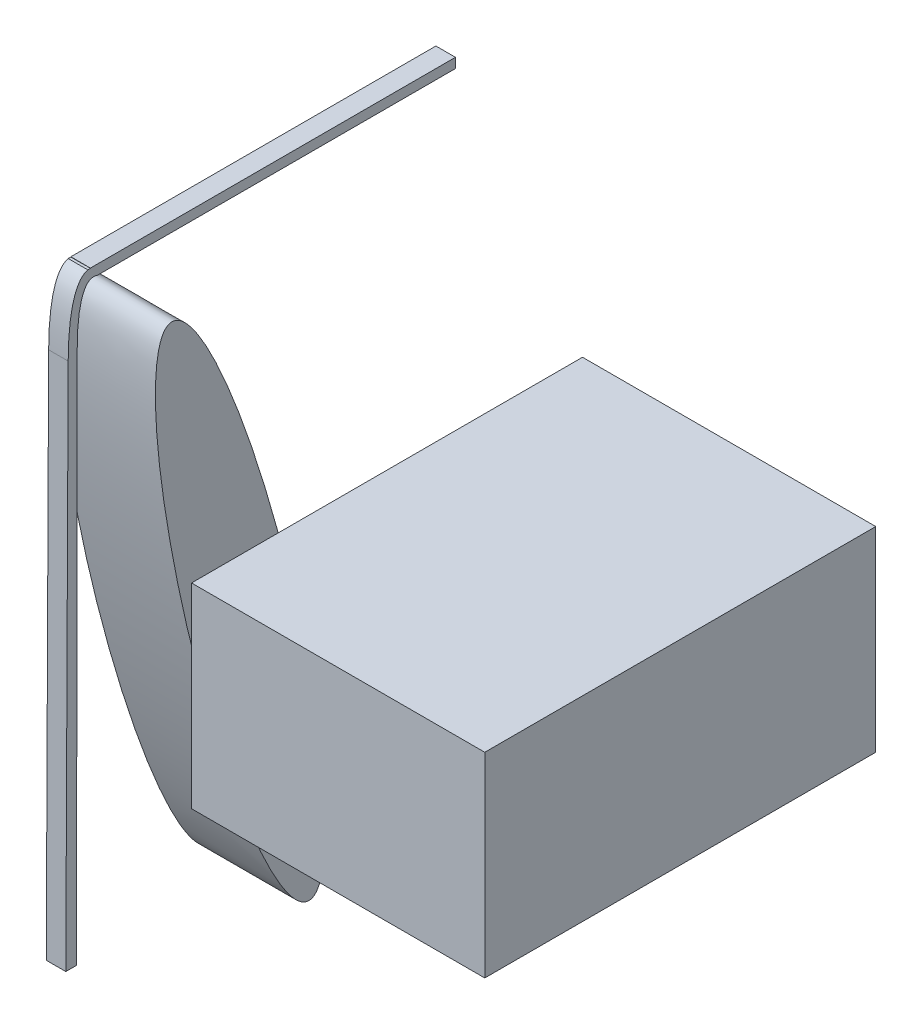
ISO-10303-21;
HEADER;
FILE_DESCRIPTION(('STEP AP214'),'2;1');
FILE_NAME('part.step','',(''),(''),'','','');
FILE_SCHEMA(('AUTOMOTIVE_DESIGN { 1 0 10303 214 1 1 1 1 }'));
ENDSEC;
DATA;
#1=APPLICATION_CONTEXT('core data for automotive mechanical design processes');
#2=APPLICATION_PROTOCOL_DEFINITION('international standard','automotive_design',2000,#1);
#3=PRODUCT_CONTEXT('',#1,'mechanical');
#4=PRODUCT('Part','Part','',(#3));
#5=PRODUCT_RELATED_PRODUCT_CATEGORY('part','',(#4));
#6=PRODUCT_DEFINITION_FORMATION('','',#4);
#7=PRODUCT_DEFINITION_CONTEXT('part definition',#1,'design');
#8=PRODUCT_DEFINITION('design','',#6,#7);
#9=PRODUCT_DEFINITION_SHAPE('','',#8);
#10=(LENGTH_UNIT() NAMED_UNIT(*) SI_UNIT(.MILLI.,.METRE.));
#11=(NAMED_UNIT(*) PLANE_ANGLE_UNIT() SI_UNIT($,.RADIAN.));
#12=(NAMED_UNIT(*) SI_UNIT($,.STERADIAN.) SOLID_ANGLE_UNIT());
#13=UNCERTAINTY_MEASURE_WITH_UNIT(LENGTH_MEASURE(1.E-05),#10,'distance_accuracy_value','');
#14=(GEOMETRIC_REPRESENTATION_CONTEXT(3) GLOBAL_UNCERTAINTY_ASSIGNED_CONTEXT((#13)) GLOBAL_UNIT_ASSIGNED_CONTEXT((#10,
#11,#12)) REPRESENTATION_CONTEXT('',''));
#15=CARTESIAN_POINT('',(0.,0.,0.));
#16=DIRECTION('',(0.,0.,1.));
#17=DIRECTION('',(1.,0.,0.));
#18=AXIS2_PLACEMENT_3D('',#15,#16,#17);
#19=CARTESIAN_POINT('',(-13.,0.,37.3485003244142));
#20=DIRECTION('',(0.,0.,1.));
#21=DIRECTION('',(1.,0.,0.));
#22=AXIS2_PLACEMENT_3D('',#19,#20,#21);
#23=PLANE('',#22);
#24=DIRECTION('',(0.,1.,0.));
#25=VECTOR('',#24,1.);
#26=CARTESIAN_POINT('',(-15.,0.,37.3485003244142));
#27=LINE('',#26,#25);
#28=CARTESIAN_POINT('',(-15.,40.0508557961112,37.3485003244142));
#29=VERTEX_POINT('',#28);
#30=CARTESIAN_POINT('',(-15.,40.0746483582424,37.3485003244142));
#31=VERTEX_POINT('',#30);
#32=EDGE_CURVE('E500',#29,#31,#27,.T.);
#33=ORIENTED_EDGE('',*,*,#32,.F.);
#34=DIRECTION('',(1.,0.,0.));
#35=VECTOR('',#34,1.);
#36=CARTESIAN_POINT('',(-13.,40.0508557961112,37.3485003244142));
#37=LINE('',#36,#35);
#38=CARTESIAN_POINT('',(-13.,40.0508557961112,37.3485003244142));
#39=VERTEX_POINT('',#38);
#40=EDGE_CURVE('E493',#29,#39,#37,.T.);
#41=ORIENTED_EDGE('',*,*,#40,.T.);
#42=DIRECTION('',(0.,1.,0.));
#43=VECTOR('',#42,1.);
#44=CARTESIAN_POINT('',(-13.,0.,37.3485003244142));
#45=LINE('',#44,#43);
#46=CARTESIAN_POINT('',(-13.,40.0746483582424,37.3485003244142));
#47=VERTEX_POINT('',#46);
#48=EDGE_CURVE('E524',#39,#47,#45,.T.);
#49=ORIENTED_EDGE('',*,*,#48,.T.);
#50=DIRECTION('',(-1.,0.,0.));
#51=VECTOR('',#50,1.);
#52=CARTESIAN_POINT('',(-13.,40.0746483582424,37.3485003244142));
#53=LINE('',#52,#51);
#54=EDGE_CURVE('E502',#47,#31,#53,.T.);
#55=ORIENTED_EDGE('',*,*,#54,.T.);
#56=EDGE_LOOP('',(#33,#41,#49,#55));
#57=FACE_BOUND('',#56,.T.);
#58=ADVANCED_FACE('F37',(#57),#23,.T.);
#59=CARTESIAN_POINT('',(-15.,10.,30.));
#60=DIRECTION('',(-1.,0.,0.));
#61=DIRECTION('',(0.,0.970628381176253,0.240583760165074));
#62=AXIS2_PLACEMENT_3D('',#59,#60,#61);
#63=ELLIPSE('',#62,30.,5.);
#64=DIRECTION('',(1.,0.,0.));
#65=VECTOR('',#64,1.);
#66=SURFACE_OF_LINEAR_EXTRUSION('',#63,#65);
#67=CARTESIAN_POINT('',(-5.,10.,30.));
#68=DIRECTION('',(-1.,0.,0.));
#69=DIRECTION('',(0.,0.970628381176253,0.240583760165074));
#70=AXIS2_PLACEMENT_3D('',#67,#68,#69);
#71=ELLIPSE('',#70,30.,5.);
#72=CARTESIAN_POINT('',(-5.,39.1188514352876,37.2175128049522));
#73=VERTEX_POINT('',#72);
#74=EDGE_CURVE('E223',#73,#73,#71,.T.);
#75=ORIENTED_EDGE('',*,*,#74,.T.);
#76=EDGE_LOOP('',(#75));
#77=FACE_BOUND('',#76,.T.);
#78=DIRECTION('',(1.,0.,0.));
#79=VECTOR('',#78,1.);
#80=CARTESIAN_POINT('',(-15.,39.0746483582424,36.6403753439607));
#81=LINE('',#80,#79);
#82=CARTESIAN_POINT('',(-13.,39.0746483582424,36.6403753439607));
#83=VERTEX_POINT('',#82);
#84=CARTESIAN_POINT('',(-15.,39.0746483582424,36.6403753439607));
#85=VERTEX_POINT('',#84);
#86=EDGE_CURVE('E224',#83,#85,#81,.F.);
#87=ORIENTED_EDGE('',*,*,#86,.F.);
#88=CARTESIAN_POINT('',(-13.,10.,30.));
#89=DIRECTION('',(-1.,0.,0.));
#90=DIRECTION('',(0.,0.970628381176253,0.240583760165074));
#91=AXIS2_PLACEMENT_3D('',#88,#89,#90);
#92=ELLIPSE('',#91,30.,5.);
#93=CARTESIAN_POINT('',(-13.,33.5140158510238,38.697434300692));
#94=VERTEX_POINT('',#93);
#95=EDGE_CURVE('E11',#94,#83,#92,.T.);
#96=ORIENTED_EDGE('',*,*,#95,.F.);
#97=DIRECTION('',(-1.,0.,0.));
#98=VECTOR('',#97,1.);
#99=CARTESIAN_POINT('',(-13.,33.5140158510238,38.697434300692));
#100=LINE('',#99,#98);
#101=CARTESIAN_POINT('',(-15.,33.5140158510238,38.697434300692));
#102=VERTEX_POINT('',#101);
#103=EDGE_CURVE('E161',#94,#102,#100,.T.);
#104=ORIENTED_EDGE('',*,*,#103,.T.);
#105=EDGE_CURVE('E218',#85,#102,#63,.T.);
#106=ORIENTED_EDGE('',*,*,#105,.F.);
#107=EDGE_LOOP('',(#87,#96,#104,#106));
#108=FACE_BOUND('',#107,.T.);
#109=ADVANCED_FACE('F200',(#77,#108),#66,.F.);
#110=CARTESIAN_POINT('',(0.,0.,40.));
#111=DIRECTION('',(1.,0.,0.));
#112=DIRECTION('',(0.,0.,-1.));
#113=AXIS2_PLACEMENT_3D('',#110,#111,#112);
#114=PLANE('',#113);
#115=CARTESIAN_POINT('',(0.,10.,30.));
#116=DIRECTION('',(1.,0.,0.));
#117=DIRECTION('',(0.,0.,-1.));
#118=AXIS2_PLACEMENT_3D('',#115,#116,#117);
#119=CIRCLE('',#118,2.);
#120=CARTESIAN_POINT('',(0.,10.,28.));
#121=VERTEX_POINT('',#120);
#122=EDGE_CURVE('E45',#121,#121,#119,.F.);
#123=ORIENTED_EDGE('',*,*,#122,.F.);
#124=EDGE_LOOP('',(#123));
#125=FACE_BOUND('',#124,.T.);
#126=DIRECTION('',(0.,-1.,0.));
#127=VECTOR('',#126,1.);
#128=CARTESIAN_POINT('',(0.,0.,0.));
#129=LINE('',#128,#127);
#130=CARTESIAN_POINT('',(0.,20.,0.));
#131=VERTEX_POINT('',#130);
#132=CARTESIAN_POINT('',(0.,0.,0.));
#133=VERTEX_POINT('',#132);
#134=EDGE_CURVE('E230',#131,#133,#129,.T.);
#135=ORIENTED_EDGE('',*,*,#134,.T.);
#136=DIRECTION('',(0.,0.,-1.));
#137=VECTOR('',#136,1.);
#138=CARTESIAN_POINT('',(0.,0.,40.));
#139=LINE('',#138,#137);
#140=CARTESIAN_POINT('',(0.,0.,40.));
#141=VERTEX_POINT('',#140);
#142=EDGE_CURVE('E257',#141,#133,#139,.T.);
#143=ORIENTED_EDGE('',*,*,#142,.F.);
#144=DIRECTION('',(0.,-1.,0.));
#145=VECTOR('',#144,1.);
#146=CARTESIAN_POINT('',(0.,0.,40.));
#147=LINE('',#146,#145);
#148=CARTESIAN_POINT('',(0.,20.,40.));
#149=VERTEX_POINT('',#148);
#150=EDGE_CURVE('E231',#149,#141,#147,.T.);
#151=ORIENTED_EDGE('',*,*,#150,.F.);
#152=DIRECTION('',(0.,0.,-1.));
#153=VECTOR('',#152,1.);
#154=CARTESIAN_POINT('',(0.,20.,40.));
#155=LINE('',#154,#153);
#156=EDGE_CURVE('E241',#149,#131,#155,.T.);
#157=ORIENTED_EDGE('',*,*,#156,.T.);
#158=EDGE_LOOP('',(#135,#143,#151,#157));
#159=FACE_BOUND('',#158,.T.);
#160=ADVANCED_FACE('F39',(#125,#159),#114,.F.);
#161=CARTESIAN_POINT('',(0.,0.,40.));
#162=DIRECTION('',(0.,1.,0.));
#163=DIRECTION('',(0.,0.,1.));
#164=AXIS2_PLACEMENT_3D('',#161,#162,#163);
#165=PLANE('',#164);
#166=DIRECTION('',(1.,0.,0.));
#167=VECTOR('',#166,1.);
#168=CARTESIAN_POINT('',(0.,0.,0.));
#169=LINE('',#168,#167);
#170=CARTESIAN_POINT('',(30.,0.,0.));
#171=VERTEX_POINT('',#170);
#172=EDGE_CURVE('E244',#133,#171,#169,.T.);
#173=ORIENTED_EDGE('',*,*,#172,.T.);
#174=DIRECTION('',(0.,0.,-1.));
#175=VECTOR('',#174,1.);
#176=CARTESIAN_POINT('',(30.,0.,40.));
#177=LINE('',#176,#175);
#178=CARTESIAN_POINT('',(30.,0.,40.));
#179=VERTEX_POINT('',#178);
#180=EDGE_CURVE('E254',#179,#171,#177,.T.);
#181=ORIENTED_EDGE('',*,*,#180,.F.);
#182=DIRECTION('',(1.,0.,0.));
#183=VECTOR('',#182,1.);
#184=CARTESIAN_POINT('',(0.,0.,40.));
#185=LINE('',#184,#183);
#186=EDGE_CURVE('E234',#141,#179,#185,.T.);
#187=ORIENTED_EDGE('',*,*,#186,.F.);
#188=ORIENTED_EDGE('',*,*,#142,.T.);
#189=EDGE_LOOP('',(#173,#181,#187,#188));
#190=FACE_BOUND('',#189,.T.);
#191=ADVANCED_FACE('F265',(#190),#165,.F.);
#192=CARTESIAN_POINT('',(30.,0.,40.));
#193=DIRECTION('',(-1.,0.,0.));
#194=DIRECTION('',(0.,0.,1.));
#195=AXIS2_PLACEMENT_3D('',#192,#193,#194);
#196=PLANE('',#195);
#197=DIRECTION('',(0.,1.,0.));
#198=VECTOR('',#197,1.);
#199=CARTESIAN_POINT('',(30.,0.,0.));
#200=LINE('',#199,#198);
#201=CARTESIAN_POINT('',(30.,20.,0.));
#202=VERTEX_POINT('',#201);
#203=EDGE_CURVE('E246',#171,#202,#200,.T.);
#204=ORIENTED_EDGE('',*,*,#203,.T.);
#205=DIRECTION('',(0.,0.,-1.));
#206=VECTOR('',#205,1.);
#207=CARTESIAN_POINT('',(30.,20.,40.));
#208=LINE('',#207,#206);
#209=CARTESIAN_POINT('',(30.,20.,40.));
#210=VERTEX_POINT('',#209);
#211=EDGE_CURVE('E251',#210,#202,#208,.T.);
#212=ORIENTED_EDGE('',*,*,#211,.F.);
#213=DIRECTION('',(0.,1.,0.));
#214=VECTOR('',#213,1.);
#215=CARTESIAN_POINT('',(30.,0.,40.));
#216=LINE('',#215,#214);
#217=EDGE_CURVE('E237',#179,#210,#216,.T.);
#218=ORIENTED_EDGE('',*,*,#217,.F.);
#219=ORIENTED_EDGE('',*,*,#180,.T.);
#220=EDGE_LOOP('',(#204,#212,#218,#219));
#221=FACE_BOUND('',#220,.T.);
#222=ADVANCED_FACE('F284',(#221),#196,.F.);
#223=CARTESIAN_POINT('',(0.,20.,40.));
#224=DIRECTION('',(0.,-1.,0.));
#225=DIRECTION('',(0.,0.,-1.));
#226=AXIS2_PLACEMENT_3D('',#223,#224,#225);
#227=PLANE('',#226);
#228=DIRECTION('',(-1.,0.,0.));
#229=VECTOR('',#228,1.);
#230=CARTESIAN_POINT('',(0.,20.,0.));
#231=LINE('',#230,#229);
#232=EDGE_CURVE('E235',#202,#131,#231,.T.);
#233=ORIENTED_EDGE('',*,*,#232,.T.);
#234=ORIENTED_EDGE('',*,*,#156,.F.);
#235=DIRECTION('',(-1.,0.,0.));
#236=VECTOR('',#235,1.);
#237=CARTESIAN_POINT('',(0.,20.,40.));
#238=LINE('',#237,#236);
#239=EDGE_CURVE('E239',#210,#149,#238,.T.);
#240=ORIENTED_EDGE('',*,*,#239,.F.);
#241=ORIENTED_EDGE('',*,*,#211,.T.);
#242=EDGE_LOOP('',(#233,#234,#240,#241));
#243=FACE_BOUND('',#242,.T.);
#244=ADVANCED_FACE('F282',(#243),#227,.F.);
#245=CARTESIAN_POINT('',(0.,0.,40.));
#246=DIRECTION('',(0.,0.,-1.));
#247=DIRECTION('',(-1.,0.,0.));
#248=AXIS2_PLACEMENT_3D('',#245,#246,#247);
#249=PLANE('',#248);
#250=ORIENTED_EDGE('',*,*,#150,.T.);
#251=ORIENTED_EDGE('',*,*,#186,.T.);
#252=ORIENTED_EDGE('',*,*,#217,.T.);
#253=ORIENTED_EDGE('',*,*,#239,.T.);
#254=EDGE_LOOP('',(#250,#251,#252,#253));
#255=FACE_BOUND('',#254,.T.);
#256=ADVANCED_FACE('F278',(#255),#249,.F.);
#257=CARTESIAN_POINT('',(0.,0.,0.));
#258=DIRECTION('',(0.,0.,-1.));
#259=DIRECTION('',(-1.,0.,0.));
#260=AXIS2_PLACEMENT_3D('',#257,#258,#259);
#261=PLANE('',#260);
#262=ORIENTED_EDGE('',*,*,#134,.F.);
#263=ORIENTED_EDGE('',*,*,#232,.F.);
#264=ORIENTED_EDGE('',*,*,#203,.F.);
#265=ORIENTED_EDGE('',*,*,#172,.F.);
#266=EDGE_LOOP('',(#262,#263,#264,#265));
#267=FACE_BOUND('',#266,.T.);
#268=ADVANCED_FACE('F272',(#267),#261,.T.);
#269=CARTESIAN_POINT('',(-5.,10.,30.));
#270=DIRECTION('',(1.,0.,0.));
#271=DIRECTION('',(0.,0.,-1.));
#272=AXIS2_PLACEMENT_3D('',#269,#270,#271);
#273=CYLINDRICAL_SURFACE('',#272,2.);
#274=CARTESIAN_POINT('',(-5.,10.,30.));
#275=DIRECTION('',(-1.,0.,0.));
#276=DIRECTION('',(0.,0.,1.));
#277=AXIS2_PLACEMENT_3D('',#274,#275,#276);
#278=CIRCLE('',#277,2.);
#279=CARTESIAN_POINT('',(-5.,10.,32.));
#280=VERTEX_POINT('',#279);
#281=EDGE_CURVE('E222',#280,#280,#278,.T.);
#282=ORIENTED_EDGE('',*,*,#281,.F.);
#283=EDGE_LOOP('',(#282));
#284=FACE_BOUND('',#283,.T.);
#285=ORIENTED_EDGE('',*,*,#122,.T.);
#286=EDGE_LOOP('',(#285));
#287=FACE_BOUND('',#286,.T.);
#288=ADVANCED_FACE('F209',(#284,#287),#273,.T.);
#289=CARTESIAN_POINT('',(-15.,10.,30.));
#290=DIRECTION('',(-1.,0.,0.));
#291=DIRECTION('',(0.,0.,1.));
#292=AXIS2_PLACEMENT_3D('',#289,#290,#291);
#293=PLANE('',#292);
#294=ORIENTED_EDGE('',*,*,#105,.T.);
#295=DIRECTION('',(0.,-0.999999229372091,0.00124147300618938));
#296=VECTOR('',#295,1.);
#297=CARTESIAN_POINT('',(-15.,0.0480934448613429,38.7389879275843));
#298=LINE('',#297,#296);
#299=CARTESIAN_POINT('',(-15.,-21.,38.7651185875649));
#300=VERTEX_POINT('',#299);
#301=EDGE_CURVE('E539',#102,#300,#298,.T.);
#302=ORIENTED_EDGE('',*,*,#301,.T.);
#303=DIRECTION('',(0.,0.,1.));
#304=VECTOR('',#303,1.);
#305=CARTESIAN_POINT('',(-15.,-20.9999999999999,0.));
#306=LINE('',#305,#304);
#307=CARTESIAN_POINT('',(-15.,-21.,39.8624684707727));
#308=VERTEX_POINT('',#307);
#309=EDGE_CURVE('E142',#300,#308,#306,.T.);
#310=ORIENTED_EDGE('',*,*,#309,.T.);
#311=DIRECTION('',(0.,-0.999989834259744,0.00450903284201434));
#312=VECTOR('',#311,1.);
#313=CARTESIAN_POINT('',(-15.,0.179312393375753,39.7669692847997));
#314=LINE('',#313,#312);
#315=CARTESIAN_POINT('',(-15.,32.9672969363152,39.6191256827325));
#316=VERTEX_POINT('',#315);
#317=EDGE_CURVE('E536',#316,#308,#314,.T.);
#318=ORIENTED_EDGE('',*,*,#317,.F.);
#319=CARTESIAN_POINT('',(-15.,9.96074716305292,30.1584062384746));
#320=DIRECTION('',(-1.,0.,0.));
#321=DIRECTION('',(0.,0.970643196282759,0.240523981153624));
#322=AXIS2_PLACEMENT_3D('',#319,#320,#321);
#323=ELLIPSE('',#322,31.,6.);
#324=CARTESIAN_POINT('',(-15.,40.0506862478184,37.6146496542369));
#325=VERTEX_POINT('',#324);
#326=EDGE_CURVE('E163',#316,#325,#323,.T.);
#327=ORIENTED_EDGE('',*,*,#326,.T.);
#328=DIRECTION('',(0.,-0.000637041838274439,0.999999797088828));
#329=VECTOR('',#328,1.);
#330=CARTESIAN_POINT('',(-15.,40.0746320950563,0.025529222478171));
#331=LINE('',#330,#329);
#332=EDGE_CURVE('E52',#29,#325,#331,.T.);
#333=ORIENTED_EDGE('',*,*,#332,.F.);
#334=ORIENTED_EDGE('',*,*,#32,.T.);
#335=DIRECTION('',(0.,0.,1.));
#336=VECTOR('',#335,1.);
#337=CARTESIAN_POINT('',(-15.,40.0746483582424,0.));
#338=LINE('',#337,#336);
#339=CARTESIAN_POINT('',(-15.,40.0746483582424,0.));
#340=VERTEX_POINT('',#339);
#341=EDGE_CURVE('E505',#340,#31,#338,.T.);
#342=ORIENTED_EDGE('',*,*,#341,.F.);
#343=DIRECTION('',(0.,1.,0.));
#344=VECTOR('',#343,1.);
#345=CARTESIAN_POINT('',(-15.,0.,0.));
#346=LINE('',#345,#344);
#347=CARTESIAN_POINT('',(-15.,39.0746483582424,0.));
#348=VERTEX_POINT('',#347);
#349=EDGE_CURVE('E507',#348,#340,#346,.T.);
#350=ORIENTED_EDGE('',*,*,#349,.F.);
#351=DIRECTION('',(0.,0.,-1.));
#352=VECTOR('',#351,1.);
#353=CARTESIAN_POINT('',(-15.,39.0746483582424,0.));
#354=LINE('',#353,#352);
#355=EDGE_CURVE('E59',#85,#348,#354,.T.);
#356=ORIENTED_EDGE('',*,*,#355,.F.);
#357=EDGE_LOOP('',(#294,#302,#310,#318,#327,#333,#334,#342,#350,#356));
#358=FACE_BOUND('',#357,.T.);
#359=ADVANCED_FACE('F206',(#358),#293,.T.);
#360=CARTESIAN_POINT('',(-5.,10.,30.));
#361=DIRECTION('',(-1.,0.,0.));
#362=DIRECTION('',(0.,0.,1.));
#363=AXIS2_PLACEMENT_3D('',#360,#361,#362);
#364=PLANE('',#363);
#365=ORIENTED_EDGE('',*,*,#281,.T.);
#366=EDGE_LOOP('',(#365));
#367=FACE_BOUND('',#366,.T.);
#368=ORIENTED_EDGE('',*,*,#74,.F.);
#369=EDGE_LOOP('',(#368));
#370=FACE_BOUND('',#369,.T.);
#371=ADVANCED_FACE('F204',(#367,#370),#364,.F.);
#372=CARTESIAN_POINT('',(-13.,39.0746483582424,0.));
#373=DIRECTION('',(0.,1.,0.));
#374=DIRECTION('',(0.,0.,1.));
#375=AXIS2_PLACEMENT_3D('',#372,#373,#374);
#376=PLANE('',#375);
#377=DIRECTION('',(0.,0.,-1.));
#378=VECTOR('',#377,1.);
#379=CARTESIAN_POINT('',(-13.,39.0746483582424,0.));
#380=LINE('',#379,#378);
#381=CARTESIAN_POINT('',(-13.,39.0746483582424,0.));
#382=VERTEX_POINT('',#381);
#383=EDGE_CURVE('E513',#83,#382,#380,.T.);
#384=ORIENTED_EDGE('',*,*,#383,.F.);
#385=ORIENTED_EDGE('',*,*,#86,.T.);
#386=ORIENTED_EDGE('',*,*,#355,.T.);
#387=DIRECTION('',(-1.,0.,0.));
#388=VECTOR('',#387,1.);
#389=CARTESIAN_POINT('',(-13.,39.0746483582424,0.));
#390=LINE('',#389,#388);
#391=EDGE_CURVE('E514',#382,#348,#390,.T.);
#392=ORIENTED_EDGE('',*,*,#391,.F.);
#393=EDGE_LOOP('',(#384,#385,#386,#392));
#394=FACE_BOUND('',#393,.T.);
#395=ADVANCED_FACE('F193',(#394),#376,.F.);
#396=CARTESIAN_POINT('',(-13.,0.,0.));
#397=DIRECTION('',(0.,0.,1.));
#398=DIRECTION('',(1.,0.,0.));
#399=AXIS2_PLACEMENT_3D('',#396,#397,#398);
#400=PLANE('',#399);
#401=ORIENTED_EDGE('',*,*,#349,.T.);
#402=DIRECTION('',(-1.,0.,0.));
#403=VECTOR('',#402,1.);
#404=CARTESIAN_POINT('',(-13.,40.0746483582424,0.));
#405=LINE('',#404,#403);
#406=CARTESIAN_POINT('',(-13.,40.0746483582424,0.));
#407=VERTEX_POINT('',#406);
#408=EDGE_CURVE('E517',#407,#340,#405,.T.);
#409=ORIENTED_EDGE('',*,*,#408,.F.);
#410=DIRECTION('',(0.,1.,0.));
#411=VECTOR('',#410,1.);
#412=CARTESIAN_POINT('',(-13.,0.,0.));
#413=LINE('',#412,#411);
#414=EDGE_CURVE('E519',#382,#407,#413,.T.);
#415=ORIENTED_EDGE('',*,*,#414,.F.);
#416=ORIENTED_EDGE('',*,*,#391,.T.);
#417=EDGE_LOOP('',(#401,#409,#415,#416));
#418=FACE_BOUND('',#417,.T.);
#419=ADVANCED_FACE('F190',(#418),#400,.F.);
#420=CARTESIAN_POINT('',(-13.,40.0746483582424,0.));
#421=DIRECTION('',(0.,-1.,0.));
#422=DIRECTION('',(0.,0.,-1.));
#423=AXIS2_PLACEMENT_3D('',#420,#421,#422);
#424=PLANE('',#423);
#425=ORIENTED_EDGE('',*,*,#341,.T.);
#426=ORIENTED_EDGE('',*,*,#54,.F.);
#427=DIRECTION('',(0.,0.,1.));
#428=VECTOR('',#427,1.);
#429=CARTESIAN_POINT('',(-13.,40.0746483582424,0.));
#430=LINE('',#429,#428);
#431=EDGE_CURVE('E520',#407,#47,#430,.T.);
#432=ORIENTED_EDGE('',*,*,#431,.F.);
#433=ORIENTED_EDGE('',*,*,#408,.T.);
#434=EDGE_LOOP('',(#425,#426,#432,#433));
#435=FACE_BOUND('',#434,.T.);
#436=ADVANCED_FACE('F189',(#435),#424,.F.);
#437=CARTESIAN_POINT('',(-13.,0.,0.));
#438=DIRECTION('',(-1.,0.,0.));
#439=DIRECTION('',(0.,0.,1.));
#440=AXIS2_PLACEMENT_3D('',#437,#438,#439);
#441=PLANE('',#440);
#442=ORIENTED_EDGE('',*,*,#414,.T.);
#443=ORIENTED_EDGE('',*,*,#431,.T.);
#444=ORIENTED_EDGE('',*,*,#48,.F.);
#445=DIRECTION('',(0.,-0.000637041838274439,0.999999797088828));
#446=VECTOR('',#445,1.);
#447=CARTESIAN_POINT('',(-13.,40.0746320950563,0.025529222478171));
#448=LINE('',#447,#446);
#449=CARTESIAN_POINT('',(-13.,40.0506862478184,37.6146496542369));
#450=VERTEX_POINT('',#449);
#451=EDGE_CURVE('E147',#39,#450,#448,.T.);
#452=ORIENTED_EDGE('',*,*,#451,.T.);
#453=CARTESIAN_POINT('',(-13.,9.96074716305292,30.1584062384746));
#454=DIRECTION('',(-1.,0.,0.));
#455=DIRECTION('',(0.,0.970643196282759,0.240523981153624));
#456=AXIS2_PLACEMENT_3D('',#453,#454,#455);
#457=ELLIPSE('',#456,31.,6.);
#458=CARTESIAN_POINT('',(-13.,32.9672969363152,39.6191256827325));
#459=VERTEX_POINT('',#458);
#460=EDGE_CURVE('E167',#459,#450,#457,.T.);
#461=ORIENTED_EDGE('',*,*,#460,.F.);
#462=DIRECTION('',(0.,-0.999989834259744,0.00450903284201434));
#463=VECTOR('',#462,1.);
#464=CARTESIAN_POINT('',(-13.,0.179312393375753,39.7669692847997));
#465=LINE('',#464,#463);
#466=CARTESIAN_POINT('',(-13.,-21.,39.8624684707727));
#467=VERTEX_POINT('',#466);
#468=EDGE_CURVE('E155',#459,#467,#465,.T.);
#469=ORIENTED_EDGE('',*,*,#468,.T.);
#470=DIRECTION('',(0.,0.,1.));
#471=VECTOR('',#470,1.);
#472=CARTESIAN_POINT('',(-13.,-20.9999999999999,0.));
#473=LINE('',#472,#471);
#474=CARTESIAN_POINT('',(-13.,-21.,38.7651185875649));
#475=VERTEX_POINT('',#474);
#476=EDGE_CURVE('E140',#475,#467,#473,.T.);
#477=ORIENTED_EDGE('',*,*,#476,.F.);
#478=DIRECTION('',(0.,-0.999999229372091,0.00124147300618938));
#479=VECTOR('',#478,1.);
#480=CARTESIAN_POINT('',(-13.,0.0480934448613429,38.7389879275843));
#481=LINE('',#480,#479);
#482=EDGE_CURVE('E152',#94,#475,#481,.T.);
#483=ORIENTED_EDGE('',*,*,#482,.F.);
#484=ORIENTED_EDGE('',*,*,#95,.T.);
#485=ORIENTED_EDGE('',*,*,#383,.T.);
#486=EDGE_LOOP('',(#442,#443,#444,#452,#461,#469,#477,#483,#484,#485));
#487=FACE_BOUND('',#486,.T.);
#488=ADVANCED_FACE('F151',(#487),#441,.F.);
#489=CARTESIAN_POINT('',(-13.,0.0480934448613429,38.7389879275843));
#490=DIRECTION('',(0.,-0.00124147300618938,-0.99999922937209));
#491=DIRECTION('',(0.,0.999999229372091,-0.00124147300618938));
#492=AXIS2_PLACEMENT_3D('',#489,#490,#491);
#493=PLANE('',#492);
#494=ORIENTED_EDGE('',*,*,#301,.F.);
#495=ORIENTED_EDGE('',*,*,#103,.F.);
#496=ORIENTED_EDGE('',*,*,#482,.T.);
#497=DIRECTION('',(-1.,0.,0.));
#498=VECTOR('',#497,1.);
#499=CARTESIAN_POINT('',(-13.,-21.,38.7651185875649));
#500=LINE('',#499,#498);
#501=EDGE_CURVE('E137',#475,#300,#500,.T.);
#502=ORIENTED_EDGE('',*,*,#501,.T.);
#503=EDGE_LOOP('',(#494,#495,#496,#502));
#504=FACE_BOUND('',#503,.T.);
#505=ADVANCED_FACE('F159',(#504),#493,.T.);
#506=CARTESIAN_POINT('',(-13.,40.0746320950563,0.025529222478171));
#507=DIRECTION('',(0.,-0.999999797088828,-0.000637041838274439));
#508=DIRECTION('',(0.,0.000637041838274439,-0.999999797088828));
#509=AXIS2_PLACEMENT_3D('',#506,#507,#508);
#510=PLANE('',#509);
#511=ORIENTED_EDGE('',*,*,#40,.F.);
#512=ORIENTED_EDGE('',*,*,#332,.T.);
#513=DIRECTION('',(-1.,0.,0.));
#514=VECTOR('',#513,1.);
#515=CARTESIAN_POINT('',(-13.,40.0506862478184,37.6146496542369));
#516=LINE('',#515,#514);
#517=EDGE_CURVE('E532',#450,#325,#516,.T.);
#518=ORIENTED_EDGE('',*,*,#517,.F.);
#519=ORIENTED_EDGE('',*,*,#451,.F.);
#520=EDGE_LOOP('',(#511,#512,#518,#519));
#521=FACE_BOUND('',#520,.T.);
#522=ADVANCED_FACE('F178',(#521),#510,.F.);
#523=DIRECTION('',(-1.,0.,0.));
#524=VECTOR('',#523,1.);
#525=SURFACE_OF_LINEAR_EXTRUSION('',#457,#524);
#526=ORIENTED_EDGE('',*,*,#326,.F.);
#527=DIRECTION('',(-1.,0.,0.));
#528=VECTOR('',#527,1.);
#529=CARTESIAN_POINT('',(-13.,32.9672969363152,39.6191256827325));
#530=LINE('',#529,#528);
#531=EDGE_CURVE('E530',#459,#316,#530,.T.);
#532=ORIENTED_EDGE('',*,*,#531,.F.);
#533=ORIENTED_EDGE('',*,*,#460,.T.);
#534=ORIENTED_EDGE('',*,*,#517,.T.);
#535=EDGE_LOOP('',(#526,#532,#533,#534));
#536=FACE_BOUND('',#535,.T.);
#537=ADVANCED_FACE('F173',(#536),#525,.T.);
#538=CARTESIAN_POINT('',(-13.,0.179312393375753,39.7669692847997));
#539=DIRECTION('',(0.,-0.00450903284201434,-0.999989834259744));
#540=DIRECTION('',(0.,0.999989834259744,-0.00450903284201434));
#541=AXIS2_PLACEMENT_3D('',#538,#539,#540);
#542=PLANE('',#541);
#543=ORIENTED_EDGE('',*,*,#317,.T.);
#544=DIRECTION('',(-1.,0.,0.));
#545=VECTOR('',#544,1.);
#546=CARTESIAN_POINT('',(-13.,-21.,39.8624684707727));
#547=LINE('',#546,#545);
#548=EDGE_CURVE('E146',#467,#308,#547,.T.);
#549=ORIENTED_EDGE('',*,*,#548,.F.);
#550=ORIENTED_EDGE('',*,*,#468,.F.);
#551=ORIENTED_EDGE('',*,*,#531,.T.);
#552=EDGE_LOOP('',(#543,#549,#550,#551));
#553=FACE_BOUND('',#552,.T.);
#554=ADVANCED_FACE('F177',(#553),#542,.F.);
#555=CARTESIAN_POINT('',(-13.,-20.9999999999999,0.));
#556=DIRECTION('',(0.,-1.,0.));
#557=DIRECTION('',(0.,0.,-1.));
#558=AXIS2_PLACEMENT_3D('',#555,#556,#557);
#559=PLANE('',#558);
#560=ORIENTED_EDGE('',*,*,#309,.F.);
#561=ORIENTED_EDGE('',*,*,#501,.F.);
#562=ORIENTED_EDGE('',*,*,#476,.T.);
#563=ORIENTED_EDGE('',*,*,#548,.T.);
#564=EDGE_LOOP('',(#560,#561,#562,#563));
#565=FACE_BOUND('',#564,.T.);
#566=ADVANCED_FACE('F139',(#565),#559,.T.);
#567=CLOSED_SHELL('',(#58,#109,#160,#191,#222,#244,#256,#268,#288,#359,#371,#395,#419,#436,#488,
#505,#522,#537,#554,#566));
#568=MANIFOLD_SOLID_BREP('B2',#567);
#569=ADVANCED_BREP_SHAPE_REPRESENTATION('',(#18,#568),#14);
#570=SHAPE_DEFINITION_REPRESENTATION(#9,#569);
ENDSEC;
END-ISO-10303-21;
